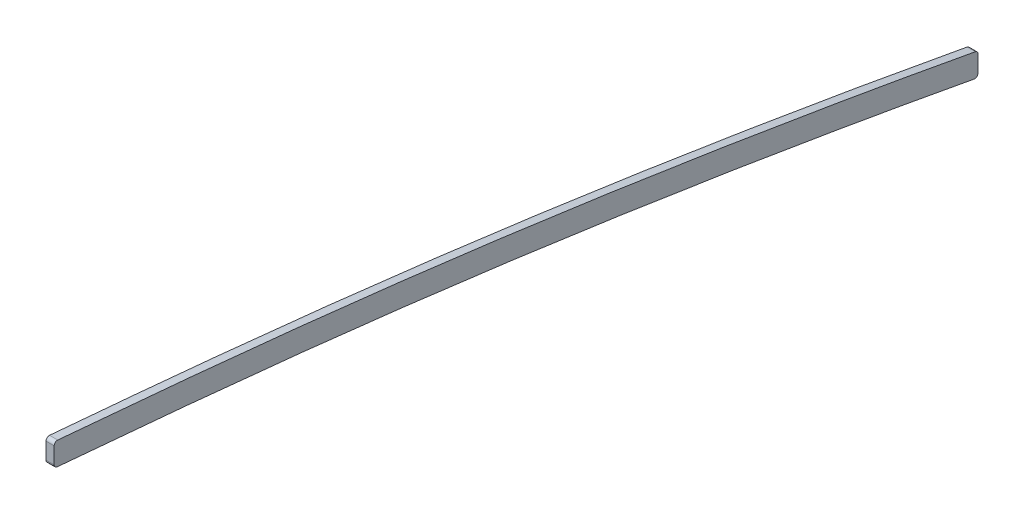
ISO-10303-21;
HEADER;
FILE_DESCRIPTION(('STEP AP214'),'2;1');
FILE_NAME('part.step','',(''),(''),'','','');
FILE_SCHEMA(('AUTOMOTIVE_DESIGN { 1 0 10303 214 1 1 1 1 }'));
ENDSEC;
DATA;
#1=APPLICATION_CONTEXT('core data for automotive mechanical design processes');
#2=APPLICATION_PROTOCOL_DEFINITION('international standard','automotive_design',2000,#1);
#3=PRODUCT_CONTEXT('',#1,'mechanical');
#4=PRODUCT('Part','Part','',(#3));
#5=PRODUCT_RELATED_PRODUCT_CATEGORY('part','',(#4));
#6=PRODUCT_DEFINITION_FORMATION('','',#4);
#7=PRODUCT_DEFINITION_CONTEXT('part definition',#1,'design');
#8=PRODUCT_DEFINITION('design','',#6,#7);
#9=PRODUCT_DEFINITION_SHAPE('','',#8);
#10=(LENGTH_UNIT() NAMED_UNIT(*) SI_UNIT(.MILLI.,.METRE.));
#11=(NAMED_UNIT(*) PLANE_ANGLE_UNIT() SI_UNIT($,.RADIAN.));
#12=(NAMED_UNIT(*) SI_UNIT($,.STERADIAN.) SOLID_ANGLE_UNIT());
#13=UNCERTAINTY_MEASURE_WITH_UNIT(LENGTH_MEASURE(1.E-05),#10,'distance_accuracy_value','');
#14=(GEOMETRIC_REPRESENTATION_CONTEXT(3) GLOBAL_UNCERTAINTY_ASSIGNED_CONTEXT((#13)) GLOBAL_UNIT_ASSIGNED_CONTEXT((#10,
#11,#12)) REPRESENTATION_CONTEXT('',''));
#15=CARTESIAN_POINT('',(0.,0.,0.));
#16=DIRECTION('',(0.,0.,1.));
#17=DIRECTION('',(1.,0.,0.));
#18=AXIS2_PLACEMENT_3D('',#15,#16,#17);
#19=CARTESIAN_POINT('',(-1.5875,0.,-2311.4));
#20=DIRECTION('',(0.,0.,1.));
#21=DIRECTION('',(1.,0.,0.));
#22=AXIS2_PLACEMENT_3D('',#19,#20,#21);
#23=PLANE('',#22);
#24=DIRECTION('',(0.,-1.,0.));
#25=VECTOR('',#24,1.);
#26=CARTESIAN_POINT('',(-1.5875,0.,-2311.4));
#27=LINE('',#26,#25);
#28=CARTESIAN_POINT('',(-1.5875,85.9058570077858,-2311.4));
#29=VERTEX_POINT('',#28);
#30=CARTESIAN_POINT('',(-1.5875,79.5328261111019,-2311.4));
#31=VERTEX_POINT('',#30);
#32=EDGE_CURVE('E135',#29,#31,#27,.T.);
#33=ORIENTED_EDGE('',*,*,#32,.T.);
#34=DIRECTION('',(1.,0.,0.));
#35=VECTOR('',#34,1.);
#36=CARTESIAN_POINT('',(-1.5875,79.5328261111019,-2311.4));
#37=LINE('',#36,#35);
#38=CARTESIAN_POINT('',(1.5875,79.5328261111019,-2311.4));
#39=VERTEX_POINT('',#38);
#40=EDGE_CURVE('E123',#31,#39,#37,.T.);
#41=ORIENTED_EDGE('',*,*,#40,.T.);
#42=DIRECTION('',(0.,-1.,0.));
#43=VECTOR('',#42,1.);
#44=CARTESIAN_POINT('',(1.5875,0.,-2311.4));
#45=LINE('',#44,#43);
#46=CARTESIAN_POINT('',(1.5875,85.9058570077858,-2311.4));
#47=VERTEX_POINT('',#46);
#48=EDGE_CURVE('E106',#47,#39,#45,.T.);
#49=ORIENTED_EDGE('',*,*,#48,.F.);
#50=DIRECTION('',(-1.,0.,0.));
#51=VECTOR('',#50,1.);
#52=CARTESIAN_POINT('',(-1.5875,85.9058570077858,-2311.4));
#53=LINE('',#52,#51);
#54=EDGE_CURVE('E120',#47,#29,#53,.T.);
#55=ORIENTED_EDGE('',*,*,#54,.T.);
#56=EDGE_LOOP('',(#33,#41,#49,#55));
#57=FACE_BOUND('',#56,.T.);
#58=ADVANCED_FACE('F38',(#57),#23,.T.);
#59=CARTESIAN_POINT('',(-1.5875,123.62374006878,-1735.81133470922));
#60=CARTESIAN_POINT('',(-1.5875,121.618292624347,-1776.13863549866));
#61=CARTESIAN_POINT('',(-1.5875,119.500621805793,-1816.46028157928));
#62=CARTESIAN_POINT('',(-1.5875,115.087561884835,-1897.09366867468));
#63=CARTESIAN_POINT('',(-1.5875,112.792971084113,-1937.4056388964));
#64=CARTESIAN_POINT('',(-1.5875,108.01836652323,-2018.0184190449));
#65=CARTESIAN_POINT('',(-1.5875,105.539122976217,-2058.31951222306));
#66=CARTESIAN_POINT('',(-1.5875,100.307240032155,-2138.90378014414));
#67=CARTESIAN_POINT('',(-1.5875,97.5551279550714,-2179.18739792965));
#68=CARTESIAN_POINT('',(-1.5875,93.0801686873999,-2239.58699871448));
#69=CARTESIAN_POINT('',(-1.5875,91.5298376215323,-2259.71628097743));
#70=CARTESIAN_POINT('',(-1.5875,89.0908434299724,-2289.90044260235));
#71=CARTESIAN_POINT('',(-1.5875,88.2588450388707,-2299.96017913521));
#72=CARTESIAN_POINT('',(-1.5875,86.5528616543479,-2320.0760045662));
#73=CARTESIAN_POINT('',(-1.5875,85.6789622226699,-2330.13210089761));
#74=CARTESIAN_POINT('',(-1.5875,83.8743348466212,-2350.23935651754));
#75=CARTESIAN_POINT('',(-1.5875,82.9433074844211,-2360.29048979378));
#76=CARTESIAN_POINT('',(-1.5875,81.0031832968026,-2380.3859739712));
#77=CARTESIAN_POINT('',(-1.5875,79.9934185550902,-2390.43006537759));
#78=CARTESIAN_POINT('',(-1.5875,76.8275775323524,-2420.5470261948));
#79=CARTESIAN_POINT('',(-1.5875,74.5336729547823,-2440.6064858901));
#80=CARTESIAN_POINT('',(-1.5875,69.5562785225382,-2480.67556956821));
#81=CARTESIAN_POINT('',(-1.5875,66.8741508113434,-2500.6871518296));
#82=CARTESIAN_POINT('',(-1.5875,61.1502462952664,-2540.65429020717));
#83=CARTESIAN_POINT('',(-1.5875,58.1097556460363,-2560.61102642776));
#84=CARTESIAN_POINT('',(-1.5875,51.7024655740435,-2600.47545713133));
#85=CARTESIAN_POINT('',(-1.5875,48.3375388880153,-2620.38296708947));
#86=CARTESIAN_POINT('',(-1.5875,43.0416957000558,-2650.1996164959));
#87=CARTESIAN_POINT('',(-1.5875,41.2345222277721,-2660.13118962649));
#88=CARTESIAN_POINT('',(-1.5875,37.5258634945269,-2679.97612471736));
#89=CARTESIAN_POINT('',(-1.5875,35.6245635215631,-2689.88973979233));
#90=CARTESIAN_POINT('',(-1.5875,33.6647813022258,-2699.79233281757));
#91=B_SPLINE_CURVE_WITH_KNOTS('',3,(#59,#60,#61,#62,#63,#64,#65,#66,#67,#68,#69,#70,#71,#72,#73,
#74,#75,#76,#77,#78,#79,#80,#81,#82,#83,#84,#85,#86,#87,#88,#89,#90),.UNSPECIFIED.,.F.,.F.,(4,2,
2,2,2,2,2,2,2,2,2,2,2,2,2,4),(0.,0.125,0.25,0.375,0.5,0.5625,0.59375,0.625,0.65625,0.6875,0.75,
0.8125,0.875,0.9375,0.96875,1.),.UNSPECIFIED.);
#92=DIRECTION('',(1.,0.,0.));
#93=VECTOR('',#92,1.);
#94=SURFACE_OF_LINEAR_EXTRUSION('',#91,#93);
#95=CARTESIAN_POINT('',(-1.5875,39.6696445897951,-2668.50268386307));
#96=CARTESIAN_POINT('',(-1.5875,41.4227181411697,-2659.09628802938));
#97=CARTESIAN_POINT('',(-1.5875,43.1336678951423,-2649.68179476314));
#98=CARTESIAN_POINT('',(-1.5875,48.3375388880153,-2620.38296708947));
#99=CARTESIAN_POINT('',(-1.5875,51.7024655740435,-2600.47545713133));
#100=CARTESIAN_POINT('',(-1.5875,58.1097556460363,-2560.61102642776));
#101=CARTESIAN_POINT('',(-1.5875,61.1502462952664,-2540.65429020717));
#102=CARTESIAN_POINT('',(-1.5875,66.8741508113434,-2500.6871518296));
#103=CARTESIAN_POINT('',(-1.5875,69.5562785225382,-2480.67556956821));
#104=CARTESIAN_POINT('',(-1.5875,74.5336729547823,-2440.6064858901));
#105=CARTESIAN_POINT('',(-1.5875,76.8275775323524,-2420.5470261948));
#106=CARTESIAN_POINT('',(-1.5875,79.9934185550902,-2390.43006537759));
#107=CARTESIAN_POINT('',(-1.5875,81.0031832968026,-2380.3859739712));
#108=CARTESIAN_POINT('',(-1.5875,82.9433074844211,-2360.29048979378));
#109=CARTESIAN_POINT('',(-1.5875,83.8743348466212,-2350.23935651754));
#110=CARTESIAN_POINT('',(-1.5875,85.5964343925108,-2331.05163043528));
#111=CARTESIAN_POINT('',(-1.5875,86.3927659735339,-2321.91549454551));
#112=CARTESIAN_POINT('',(-1.5875,87.1712727423813,-2312.77781010453));
#113=B_SPLINE_CURVE_WITH_KNOTS('',3,(#95,#96,#97,#98,#99,#100,#101,#102,#103,#104,#105,#106,
#107,#108,#109,#110,#111,#112),.UNSPECIFIED.,.F.,.F.,(4,2,2,2,2,2,2,2,4),(0.596608201894419,
0.626230058276239,0.688730058276239,0.751230058276239,0.813730058276239,0.876230058276239,
0.907480058276239,0.938730058276239,0.96712185638182),.UNSPECIFIED.);
#114=CARTESIAN_POINT('',(-1.5875,87.1712718452855,-2312.7778100281));
#115=VERTEX_POINT('',#114);
#116=CARTESIAN_POINT('',(-1.5875,39.6696450424847,-2668.50268394744));
#117=VERTEX_POINT('',#116);
#118=EDGE_CURVE('E129',#115,#117,#113,.F.);
#119=ORIENTED_EDGE('',*,*,#118,.F.);
#120=DIRECTION('',(1.,0.,0.));
#121=VECTOR('',#120,1.);
#122=CARTESIAN_POINT('',(-1.5875,87.1712727423807,-2312.77781010453));
#123=LINE('',#122,#121);
#124=CARTESIAN_POINT('',(1.5875,87.1712718487435,-2312.77781002839));
#125=VERTEX_POINT('',#124);
#126=EDGE_CURVE('E225',#115,#125,#123,.T.);
#127=ORIENTED_EDGE('',*,*,#126,.T.);
#128=CARTESIAN_POINT('',(1.5875,87.1712727423811,-2312.77781010453));
#129=CARTESIAN_POINT('',(1.5875,86.3927659735338,-2321.91549454551));
#130=CARTESIAN_POINT('',(1.5875,85.5964343925107,-2331.05163043528));
#131=CARTESIAN_POINT('',(1.5875,83.8743348466212,-2350.23935651754));
#132=CARTESIAN_POINT('',(1.5875,82.9433074844211,-2360.29048979378));
#133=CARTESIAN_POINT('',(1.5875,81.0031832968026,-2380.3859739712));
#134=CARTESIAN_POINT('',(1.5875,79.9934185550902,-2390.43006537759));
#135=CARTESIAN_POINT('',(1.5875,76.8275775323524,-2420.5470261948));
#136=CARTESIAN_POINT('',(1.5875,74.5336729547823,-2440.6064858901));
#137=CARTESIAN_POINT('',(1.5875,69.5562785225382,-2480.67556956821));
#138=CARTESIAN_POINT('',(1.5875,66.8741508113434,-2500.6871518296));
#139=CARTESIAN_POINT('',(1.5875,61.1502462952664,-2540.65429020717));
#140=CARTESIAN_POINT('',(1.5875,58.1097556460363,-2560.61102642776));
#141=CARTESIAN_POINT('',(1.5875,51.7024655740435,-2600.47545713133));
#142=CARTESIAN_POINT('',(1.5875,48.3375388880153,-2620.38296708947));
#143=CARTESIAN_POINT('',(1.5875,43.1336678951423,-2649.68179476314));
#144=CARTESIAN_POINT('',(1.5875,41.4227181411698,-2659.09628802938));
#145=CARTESIAN_POINT('',(1.5875,39.6696445897952,-2668.50268386307));
#146=B_SPLINE_CURVE_WITH_KNOTS('',3,(#128,#129,#130,#131,#132,#133,#134,#135,#136,#137,#138,
#139,#140,#141,#142,#143,#144,#145),.UNSPECIFIED.,.F.,.F.,(4,2,2,2,2,2,2,2,4),
(0.596608201894421,0.625,0.65625,0.6875,0.75,0.8125,0.875,0.9375,0.967121856381819),.UNSPECIFIED.);
#147=CARTESIAN_POINT('',(1.5875,39.669645038454,-2668.50268394669));
#148=VERTEX_POINT('',#147);
#149=EDGE_CURVE('E108',#125,#148,#146,.T.);
#150=ORIENTED_EDGE('',*,*,#149,.T.);
#151=DIRECTION('',(1.,0.,0.));
#152=VECTOR('',#151,1.);
#153=CARTESIAN_POINT('',(1.5875,39.6696445897955,-2668.50268386307));
#154=LINE('',#153,#152);
#155=EDGE_CURVE('E223',#148,#117,#154,.F.);
#156=ORIENTED_EDGE('',*,*,#155,.T.);
#157=EDGE_LOOP('',(#119,#127,#150,#156));
#158=FACE_BOUND('',#157,.T.);
#159=ADVANCED_FACE('F165',(#158),#94,.F.);
#160=CARTESIAN_POINT('',(-1.5875,5.24327465958363E-10,-2669.54000000001));
#161=DIRECTION('',(0.,1.96411166702264E-13,-1.));
#162=DIRECTION('',(0.,1.,1.96411166702264E-13));
#163=AXIS2_PLACEMENT_3D('',#160,#161,#162);
#164=PLANE('',#163);
#165=DIRECTION('',(0.,1.,1.96411166702264E-13));
#166=VECTOR('',#165,1.);
#167=CARTESIAN_POINT('',(1.5875,5.24327465958363E-10,-2669.54000000001));
#168=LINE('',#167,#166);
#169=CARTESIAN_POINT('',(1.5875,31.9615735387028,-2669.54));
#170=VERTEX_POINT('',#169);
#171=CARTESIAN_POINT('',(1.5875,38.4211421989826,-2669.54));
#172=VERTEX_POINT('',#171);
#173=EDGE_CURVE('E138',#170,#172,#168,.T.);
#174=ORIENTED_EDGE('',*,*,#173,.F.);
#175=DIRECTION('',(1.,0.,0.));
#176=VECTOR('',#175,1.);
#177=CARTESIAN_POINT('',(-1.5875,31.9615735387028,-2669.54));
#178=LINE('',#177,#176);
#179=CARTESIAN_POINT('',(-1.5875,31.9615735387028,-2669.54));
#180=VERTEX_POINT('',#179);
#181=EDGE_CURVE('E11',#170,#180,#178,.F.);
#182=ORIENTED_EDGE('',*,*,#181,.T.);
#183=DIRECTION('',(0.,1.,1.96411166702264E-13));
#184=VECTOR('',#183,1.);
#185=CARTESIAN_POINT('',(-1.5875,5.24327465958363E-10,-2669.54000000001));
#186=LINE('',#185,#184);
#187=CARTESIAN_POINT('',(-1.5875,38.4211421989826,-2669.54));
#188=VERTEX_POINT('',#187);
#189=EDGE_CURVE('E133',#180,#188,#186,.T.);
#190=ORIENTED_EDGE('',*,*,#189,.T.);
#191=DIRECTION('',(-1.,0.,0.));
#192=VECTOR('',#191,1.);
#193=CARTESIAN_POINT('',(1.5875,38.4211421989826,-2669.54));
#194=LINE('',#193,#192);
#195=EDGE_CURVE('E46',#188,#172,#194,.F.);
#196=ORIENTED_EDGE('',*,*,#195,.T.);
#197=EDGE_LOOP('',(#174,#182,#190,#196));
#198=FACE_BOUND('',#197,.T.);
#199=ADVANCED_FACE('F170',(#198),#164,.T.);
#200=CARTESIAN_POINT('',(-1.5875,114.744712211049,-1735.36978708818));
#201=CARTESIAN_POINT('',(-1.5875,110.735232017816,-1815.99594072318));
#202=CARTESIAN_POINT('',(-1.5875,104.09636454831,-1936.9066504622));
#203=CARTESIAN_POINT('',(-1.5875,94.1879787504419,-2098.04948516813));
#204=CARTESIAN_POINT('',(-1.5875,87.3146385091305,-2198.69473672509));
#205=CARTESIAN_POINT('',(-1.5875,82.2221004379246,-2264.7604207429));
#206=CARTESIAN_POINT('',(-1.5875,79.2861290791442,-2300.64406981759));
#207=CARTESIAN_POINT('',(-1.5875,77.5184226804242,-2321.44664588428));
#208=CARTESIAN_POINT('',(-1.5875,74.4619434735392,-2355.87015988009));
#209=CARTESIAN_POINT('',(-1.5875,70.2016989360763,-2400.27195264392));
#210=CARTESIAN_POINT('',(-1.5875,61.1273782537238,-2479.57046826411));
#211=CARTESIAN_POINT('',(-1.5875,49.6509076137669,-2559.29208787163));
#212=CARTESIAN_POINT('',(-1.5875,38.2354847347183,-2626.79755458493));
#213=CARTESIAN_POINT('',(-1.5875,32.3571302958871,-2659.27265183733));
#214=CARTESIAN_POINT('',(-1.5875,28.6522110138429,-2679.06248770776));
#215=CARTESIAN_POINT('',(-1.5875,26.3541994456866,-2690.94044026322));
#216=CARTESIAN_POINT('',(-1.5875,24.9439248982718,-2698.06642332353));
#217=B_SPLINE_CURVE_WITH_KNOTS('',3,(#200,#201,#202,#203,#204,#205,#206,#207,#208,#209,#210,
#211,#212,#213,#214,#215,#216),.UNSPECIFIED.,.F.,.F.,(4,1,1,1,1,1,1,1,1,1,1,1,1,1,4),(0.,0.25,
0.375,0.5,0.5625,0.580337004871943,0.611587004871943,0.627212004871943,0.6875,0.75,0.875,0.9375,
0.962410670199827,0.977446402119896,1.),.UNSPECIFIED.);
#218=DIRECTION('',(1.,0.,0.));
#219=VECTOR('',#218,1.);
#220=SURFACE_OF_LINEAR_EXTRUSION('',#217,#219);
#221=CARTESIAN_POINT('',(1.5875,114.744712211049,-1735.36978708818));
#222=CARTESIAN_POINT('',(1.5875,110.735232017816,-1815.99594072318));
#223=CARTESIAN_POINT('',(1.5875,104.09636454831,-1936.9066504622));
#224=CARTESIAN_POINT('',(1.5875,94.1879787504419,-2098.04948516813));
#225=CARTESIAN_POINT('',(1.5875,87.3146385091305,-2198.69473672509));
#226=CARTESIAN_POINT('',(1.5875,82.2221004379246,-2264.7604207429));
#227=CARTESIAN_POINT('',(1.5875,79.2861290791442,-2300.64406981759));
#228=CARTESIAN_POINT('',(1.5875,77.5184226804242,-2321.44664588428));
#229=CARTESIAN_POINT('',(1.5875,74.4619434735392,-2355.87015988009));
#230=CARTESIAN_POINT('',(1.5875,70.2016989360763,-2400.27195264392));
#231=CARTESIAN_POINT('',(1.5875,61.1273782537238,-2479.57046826411));
#232=CARTESIAN_POINT('',(1.5875,49.6509076137669,-2559.29208787163));
#233=CARTESIAN_POINT('',(1.5875,38.2354847347183,-2626.79755458493));
#234=CARTESIAN_POINT('',(1.5875,32.3571302958871,-2659.27265183733));
#235=CARTESIAN_POINT('',(1.5875,28.6522110138429,-2679.06248770776));
#236=CARTESIAN_POINT('',(1.5875,26.3541994456866,-2690.94044026322));
#237=CARTESIAN_POINT('',(1.5875,24.9439248982718,-2698.06642332353));
#238=B_SPLINE_CURVE_WITH_KNOTS('',3,(#221,#222,#223,#224,#225,#226,#227,#228,#229,#230,#231,
#232,#233,#234,#235,#236,#237),.UNSPECIFIED.,.F.,.F.,(4,1,1,1,1,1,1,1,1,1,1,1,1,1,4),(0.,0.25,
0.375,0.5,0.5625,0.580337004871943,0.611587004871943,0.627212004871943,0.6875,0.75,0.875,0.9375,
0.962410670199827,0.977446402119896,1.),.UNSPECIFIED.);
#239=CARTESIAN_POINT('',(1.5875,78.2674197143551,-2312.562080349));
#240=VERTEX_POINT('',#239);
#241=CARTESIAN_POINT('',(1.5875,30.71315574617,-2668.03686266861));
#242=VERTEX_POINT('',#241);
#243=EDGE_CURVE('E124',#240,#242,#238,.T.);
#244=ORIENTED_EDGE('',*,*,#243,.F.);
#245=DIRECTION('',(1.,0.,0.));
#246=VECTOR('',#245,1.);
#247=CARTESIAN_POINT('',(1.5875,78.2674197143551,-2312.562080349));
#248=LINE('',#247,#246);
#249=CARTESIAN_POINT('',(-1.5875,78.2674197143551,-2312.562080349));
#250=VERTEX_POINT('',#249);
#251=EDGE_CURVE('E207',#240,#250,#248,.F.);
#252=ORIENTED_EDGE('',*,*,#251,.T.);
#253=CARTESIAN_POINT('',(-1.5875,30.71315574617,-2668.03686266861));
#254=VERTEX_POINT('',#253);
#255=EDGE_CURVE('E180',#250,#254,#217,.T.);
#256=ORIENTED_EDGE('',*,*,#255,.T.);
#257=DIRECTION('',(1.,0.,0.));
#258=VECTOR('',#257,1.);
#259=CARTESIAN_POINT('',(-1.5875,30.7131557461701,-2668.03686266861));
#260=LINE('',#259,#258);
#261=EDGE_CURVE('E244',#254,#242,#260,.T.);
#262=ORIENTED_EDGE('',*,*,#261,.T.);
#263=EDGE_LOOP('',(#244,#252,#256,#262));
#264=FACE_BOUND('',#263,.T.);
#265=ADVANCED_FACE('F249',(#264),#220,.T.);
#266=CARTESIAN_POINT('',(-1.5875,0.,0.));
#267=DIRECTION('',(1.,0.,0.));
#268=DIRECTION('',(0.,0.,-1.));
#269=AXIS2_PLACEMENT_3D('',#266,#267,#268);
#270=PLANE('',#269);
#271=ORIENTED_EDGE('',*,*,#255,.F.);
#272=CARTESIAN_POINT('',(-1.5875,79.5328261111019,-2312.67));
#273=DIRECTION('',(1.,0.,0.));
#274=DIRECTION('',(0.,0.,-1.));
#275=AXIS2_PLACEMENT_3D('',#272,#273,#274);
#276=CIRCLE('',#275,1.27);
#277=EDGE_CURVE('E219',#250,#31,#276,.F.);
#278=ORIENTED_EDGE('',*,*,#277,.T.);
#279=ORIENTED_EDGE('',*,*,#32,.F.);
#280=CARTESIAN_POINT('',(-1.5875,85.9058570077858,-2312.67));
#281=DIRECTION('',(1.,0.,0.));
#282=DIRECTION('',(0.,0.,-1.));
#283=AXIS2_PLACEMENT_3D('',#280,#281,#282);
#284=CIRCLE('',#283,1.27);
#285=EDGE_CURVE('E128',#29,#115,#284,.F.);
#286=ORIENTED_EDGE('',*,*,#285,.T.);
#287=ORIENTED_EDGE('',*,*,#118,.T.);
#288=CARTESIAN_POINT('',(-1.5875,38.4211421989823,-2668.27));
#289=DIRECTION('',(1.,0.,0.));
#290=DIRECTION('',(0.,0.,-1.));
#291=AXIS2_PLACEMENT_3D('',#288,#289,#290);
#292=CIRCLE('',#291,1.27);
#293=EDGE_CURVE('E53',#117,#188,#292,.F.);
#294=ORIENTED_EDGE('',*,*,#293,.T.);
#295=ORIENTED_EDGE('',*,*,#189,.F.);
#296=CARTESIAN_POINT('',(-1.5875,31.9615735387025,-2668.27));
#297=DIRECTION('',(1.,0.,0.));
#298=DIRECTION('',(0.,0.,-1.));
#299=AXIS2_PLACEMENT_3D('',#296,#297,#298);
#300=CIRCLE('',#299,1.27);
#301=EDGE_CURVE('E214',#180,#254,#300,.F.);
#302=ORIENTED_EDGE('',*,*,#301,.T.);
#303=EDGE_LOOP('',(#271,#278,#279,#286,#287,#294,#295,#302));
#304=FACE_BOUND('',#303,.T.);
#305=ADVANCED_FACE('F163',(#304),#270,.F.);
#306=CARTESIAN_POINT('',(1.5875,0.,0.));
#307=DIRECTION('',(1.,0.,0.));
#308=DIRECTION('',(0.,0.,-1.));
#309=AXIS2_PLACEMENT_3D('',#306,#307,#308);
#310=PLANE('',#309);
#311=ORIENTED_EDGE('',*,*,#48,.T.);
#312=CARTESIAN_POINT('',(1.5875,79.5328261111019,-2312.67));
#313=DIRECTION('',(1.,0.,0.));
#314=DIRECTION('',(0.,0.,-1.));
#315=AXIS2_PLACEMENT_3D('',#312,#313,#314);
#316=CIRCLE('',#315,1.27);
#317=EDGE_CURVE('E114',#39,#240,#316,.T.);
#318=ORIENTED_EDGE('',*,*,#317,.T.);
#319=ORIENTED_EDGE('',*,*,#243,.T.);
#320=CARTESIAN_POINT('',(1.5875,31.9615735387025,-2668.27));
#321=DIRECTION('',(1.,0.,0.));
#322=DIRECTION('',(0.,0.,-1.));
#323=AXIS2_PLACEMENT_3D('',#320,#321,#322);
#324=CIRCLE('',#323,1.27);
#325=EDGE_CURVE('E115',#242,#170,#324,.T.);
#326=ORIENTED_EDGE('',*,*,#325,.T.);
#327=ORIENTED_EDGE('',*,*,#173,.T.);
#328=CARTESIAN_POINT('',(1.5875,38.4211421989823,-2668.27));
#329=DIRECTION('',(1.,0.,0.));
#330=DIRECTION('',(0.,0.,-1.));
#331=AXIS2_PLACEMENT_3D('',#328,#329,#330);
#332=CIRCLE('',#331,1.27);
#333=EDGE_CURVE('E131',#172,#148,#332,.T.);
#334=ORIENTED_EDGE('',*,*,#333,.T.);
#335=ORIENTED_EDGE('',*,*,#149,.F.);
#336=CARTESIAN_POINT('',(1.5875,85.9058570077858,-2312.67));
#337=DIRECTION('',(1.,0.,0.));
#338=DIRECTION('',(0.,0.,-1.));
#339=AXIS2_PLACEMENT_3D('',#336,#337,#338);
#340=CIRCLE('',#339,1.27);
#341=EDGE_CURVE('E103',#125,#47,#340,.T.);
#342=ORIENTED_EDGE('',*,*,#341,.T.);
#343=EDGE_LOOP('',(#311,#318,#319,#326,#327,#334,#335,#342));
#344=FACE_BOUND('',#343,.T.);
#345=ADVANCED_FACE('F105',(#344),#310,.T.);
#346=CARTESIAN_POINT('',(0.,79.5328261111019,-2312.67));
#347=DIRECTION('',(1.,0.,0.));
#348=DIRECTION('',(0.,0.,-1.));
#349=AXIS2_PLACEMENT_3D('',#346,#347,#348);
#350=CYLINDRICAL_SURFACE('',#349,1.27);
#351=ORIENTED_EDGE('',*,*,#277,.F.);
#352=ORIENTED_EDGE('',*,*,#251,.F.);
#353=ORIENTED_EDGE('',*,*,#317,.F.);
#354=ORIENTED_EDGE('',*,*,#40,.F.);
#355=EDGE_LOOP('',(#351,#352,#353,#354));
#356=FACE_BOUND('',#355,.T.);
#357=ADVANCED_FACE('F162',(#356),#350,.T.);
#358=CARTESIAN_POINT('',(0.,85.9058570077858,-2312.67));
#359=DIRECTION('',(1.,0.,0.));
#360=DIRECTION('',(0.,0.,-1.));
#361=AXIS2_PLACEMENT_3D('',#358,#359,#360);
#362=CYLINDRICAL_SURFACE('',#361,1.27);
#363=ORIENTED_EDGE('',*,*,#285,.F.);
#364=ORIENTED_EDGE('',*,*,#54,.F.);
#365=ORIENTED_EDGE('',*,*,#341,.F.);
#366=ORIENTED_EDGE('',*,*,#126,.F.);
#367=EDGE_LOOP('',(#363,#364,#365,#366));
#368=FACE_BOUND('',#367,.T.);
#369=ADVANCED_FACE('F127',(#368),#362,.T.);
#370=CARTESIAN_POINT('',(0.,31.9615735387025,-2668.27));
#371=DIRECTION('',(1.,0.,0.));
#372=DIRECTION('',(0.,0.,-1.));
#373=AXIS2_PLACEMENT_3D('',#370,#371,#372);
#374=CYLINDRICAL_SURFACE('',#373,1.27);
#375=ORIENTED_EDGE('',*,*,#301,.F.);
#376=ORIENTED_EDGE('',*,*,#181,.F.);
#377=ORIENTED_EDGE('',*,*,#325,.F.);
#378=ORIENTED_EDGE('',*,*,#261,.F.);
#379=EDGE_LOOP('',(#375,#376,#377,#378));
#380=FACE_BOUND('',#379,.T.);
#381=ADVANCED_FACE('F258',(#380),#374,.T.);
#382=CARTESIAN_POINT('',(0.,38.4211421989823,-2668.27));
#383=DIRECTION('',(1.,0.,0.));
#384=DIRECTION('',(0.,0.,-1.));
#385=AXIS2_PLACEMENT_3D('',#382,#383,#384);
#386=CYLINDRICAL_SURFACE('',#385,1.27);
#387=ORIENTED_EDGE('',*,*,#293,.F.);
#388=ORIENTED_EDGE('',*,*,#155,.F.);
#389=ORIENTED_EDGE('',*,*,#333,.F.);
#390=ORIENTED_EDGE('',*,*,#195,.F.);
#391=EDGE_LOOP('',(#387,#388,#389,#390));
#392=FACE_BOUND('',#391,.T.);
#393=ADVANCED_FACE('F40',(#392),#386,.T.);
#394=CLOSED_SHELL('',(#58,#159,#199,#265,#305,#345,#357,#369,#381,#393));
#395=MANIFOLD_SOLID_BREP('B2',#394);
#396=ADVANCED_BREP_SHAPE_REPRESENTATION('',(#18,#395),#14);
#397=SHAPE_DEFINITION_REPRESENTATION(#9,#396);
ENDSEC;
END-ISO-10303-21;
